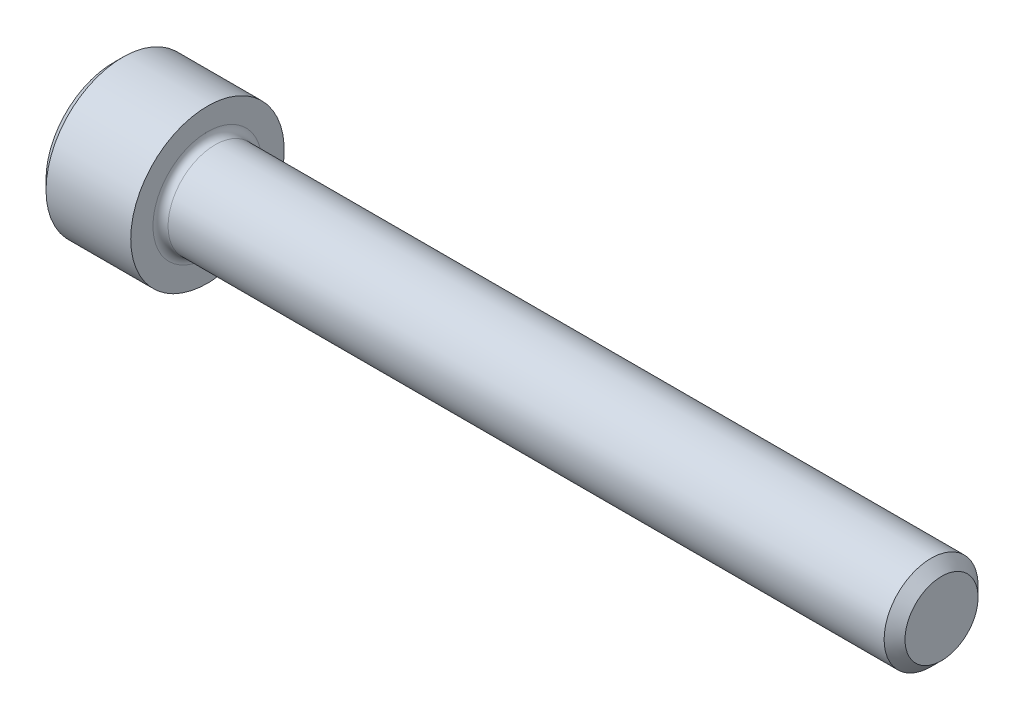
ISO-10303-21;
HEADER;
FILE_DESCRIPTION(('STEP AP214'),'2;1');
FILE_NAME('part.step','',(''),(''),'','','');
FILE_SCHEMA(('AUTOMOTIVE_DESIGN { 1 0 10303 214 1 1 1 1 }'));
ENDSEC;
DATA;
#1=APPLICATION_CONTEXT('core data for automotive mechanical design processes');
#2=APPLICATION_PROTOCOL_DEFINITION('international standard','automotive_design',2000,#1);
#3=PRODUCT_CONTEXT('',#1,'mechanical');
#4=PRODUCT('Part','Part','',(#3));
#5=PRODUCT_RELATED_PRODUCT_CATEGORY('part','',(#4));
#6=PRODUCT_DEFINITION_FORMATION('','',#4);
#7=PRODUCT_DEFINITION_CONTEXT('part definition',#1,'design');
#8=PRODUCT_DEFINITION('design','',#6,#7);
#9=PRODUCT_DEFINITION_SHAPE('','',#8);
#10=(LENGTH_UNIT() NAMED_UNIT(*) SI_UNIT(.MILLI.,.METRE.));
#11=(NAMED_UNIT(*) PLANE_ANGLE_UNIT() SI_UNIT($,.RADIAN.));
#12=(NAMED_UNIT(*) SI_UNIT($,.STERADIAN.) SOLID_ANGLE_UNIT());
#13=UNCERTAINTY_MEASURE_WITH_UNIT(LENGTH_MEASURE(1.E-05),#10,'distance_accuracy_value','');
#14=(GEOMETRIC_REPRESENTATION_CONTEXT(3) GLOBAL_UNCERTAINTY_ASSIGNED_CONTEXT((#13)) GLOBAL_UNIT_ASSIGNED_CONTEXT((#10,
#11,#12)) REPRESENTATION_CONTEXT('',''));
#15=CARTESIAN_POINT('',(0.,0.,0.));
#16=DIRECTION('',(0.,0.,1.));
#17=DIRECTION('',(1.,0.,0.));
#18=AXIS2_PLACEMENT_3D('',#15,#16,#17);
#19=CARTESIAN_POINT('',(0.,0.,0.));
#20=DIRECTION('',(-1.,0.,0.));
#21=DIRECTION('',(0.,0.,1.));
#22=AXIS2_PLACEMENT_3D('',#19,#20,#21);
#23=PLANE('',#22);
#24=DIRECTION('',(0.,-0.499999999999999,0.866025403784439));
#25=VECTOR('',#24,1.);
#26=CARTESIAN_POINT('',(0.,1.37848150271716,0.));
#27=LINE('',#26,#25);
#28=CARTESIAN_POINT('',(0.,1.37848150271716,0.));
#29=VERTEX_POINT('',#28);
#30=CARTESIAN_POINT('',(0.,0.689240751358581,1.1938));
#31=VERTEX_POINT('',#30);
#32=EDGE_CURVE('E259',#29,#31,#27,.T.);
#33=ORIENTED_EDGE('',*,*,#32,.T.);
#34=DIRECTION('',(0.,1.,0.));
#35=VECTOR('',#34,1.);
#36=CARTESIAN_POINT('',(0.,-0.689240751358569,1.1938));
#37=LINE('',#36,#35);
#38=CARTESIAN_POINT('',(0.,-0.689240751358569,1.1938));
#39=VERTEX_POINT('',#38);
#40=EDGE_CURVE('E130',#39,#31,#37,.T.);
#41=ORIENTED_EDGE('',*,*,#40,.F.);
#42=DIRECTION('',(0.,-0.500000000000001,-0.866025403784438));
#43=VECTOR('',#42,1.);
#44=CARTESIAN_POINT('',(0.,-0.689240751358569,1.1938));
#45=LINE('',#44,#43);
#46=CARTESIAN_POINT('',(0.,-1.37848150271715,0.));
#47=VERTEX_POINT('',#46);
#48=EDGE_CURVE('E262',#39,#47,#45,.T.);
#49=ORIENTED_EDGE('',*,*,#48,.T.);
#50=DIRECTION('',(0.,0.499999999999998,-0.86602540378444));
#51=VECTOR('',#50,1.);
#52=CARTESIAN_POINT('',(0.,-1.37848150271715,0.));
#53=LINE('',#52,#51);
#54=CARTESIAN_POINT('',(0.,-0.689240751358573,-1.1938));
#55=VERTEX_POINT('',#54);
#56=EDGE_CURVE('E265',#47,#55,#53,.T.);
#57=ORIENTED_EDGE('',*,*,#56,.T.);
#58=DIRECTION('',(0.,-1.,0.));
#59=VECTOR('',#58,1.);
#60=CARTESIAN_POINT('',(0.,0.689240751358577,-1.1938));
#61=LINE('',#60,#59);
#62=CARTESIAN_POINT('',(0.,0.689240751358577,-1.1938));
#63=VERTEX_POINT('',#62);
#64=EDGE_CURVE('E268',#63,#55,#61,.T.);
#65=ORIENTED_EDGE('',*,*,#64,.F.);
#66=DIRECTION('',(0.,-0.500000000000002,-0.866025403784437));
#67=VECTOR('',#66,1.);
#68=CARTESIAN_POINT('',(0.,1.37848150271716,0.));
#69=LINE('',#68,#67);
#70=EDGE_CURVE('E125',#29,#63,#69,.T.);
#71=ORIENTED_EDGE('',*,*,#70,.F.);
#72=EDGE_LOOP('',(#33,#41,#49,#57,#65,#71));
#73=FACE_BOUND('',#72,.T.);
#74=CARTESIAN_POINT('',(0.,0.,0.));
#75=DIRECTION('',(-1.,0.,0.));
#76=DIRECTION('',(0.,0.,1.));
#77=AXIS2_PLACEMENT_3D('',#74,#75,#76);
#78=CIRCLE('',#77,2.0447);
#79=CARTESIAN_POINT('',(0.,0.,2.0447));
#80=VERTEX_POINT('',#79);
#81=EDGE_CURVE('E154',#80,#80,#78,.T.);
#82=ORIENTED_EDGE('',*,*,#81,.T.);
#83=EDGE_LOOP('',(#82));
#84=FACE_BOUND('',#83,.T.);
#85=ADVANCED_FACE('F34',(#73,#84),#23,.T.);
#86=CARTESIAN_POINT('',(0.,0.,0.));
#87=DIRECTION('',(1.,0.,0.));
#88=DIRECTION('',(0.,0.,-1.));
#89=AXIS2_PLACEMENT_3D('',#86,#87,#88);
#90=CONICAL_SURFACE('',#89,2.0447,0.785398163397454);
#91=CARTESIAN_POINT('',(0.279399999999999,0.,0.));
#92=DIRECTION('',(-1.,0.,0.));
#93=DIRECTION('',(0.,0.,1.));
#94=AXIS2_PLACEMENT_3D('',#91,#92,#93);
#95=CIRCLE('',#94,2.3241);
#96=CARTESIAN_POINT('',(0.279399999999999,0.,2.3241));
#97=VERTEX_POINT('',#96);
#98=EDGE_CURVE('E151',#97,#97,#95,.T.);
#99=ORIENTED_EDGE('',*,*,#98,.T.);
#100=EDGE_LOOP('',(#99));
#101=FACE_BOUND('',#100,.T.);
#102=ORIENTED_EDGE('',*,*,#81,.F.);
#103=EDGE_LOOP('',(#102));
#104=FACE_BOUND('',#103,.T.);
#105=ADVANCED_FACE('F175',(#101,#104),#90,.T.);
#106=CARTESIAN_POINT('',(-31.75,0.,0.));
#107=DIRECTION('',(-1.,0.,0.));
#108=DIRECTION('',(0.,0.,1.));
#109=AXIS2_PLACEMENT_3D('',#106,#107,#108);
#110=CYLINDRICAL_SURFACE('',#109,2.3241);
#111=CARTESIAN_POINT('',(2.8448,0.,0.));
#112=DIRECTION('',(-1.,0.,0.));
#113=DIRECTION('',(0.,0.,1.));
#114=AXIS2_PLACEMENT_3D('',#111,#112,#113);
#115=CIRCLE('',#114,2.3241);
#116=CARTESIAN_POINT('',(2.8448,0.,2.3241));
#117=VERTEX_POINT('',#116);
#118=EDGE_CURVE('E148',#117,#117,#115,.T.);
#119=ORIENTED_EDGE('',*,*,#118,.T.);
#120=EDGE_LOOP('',(#119));
#121=FACE_BOUND('',#120,.T.);
#122=ORIENTED_EDGE('',*,*,#98,.F.);
#123=EDGE_LOOP('',(#122));
#124=FACE_BOUND('',#123,.T.);
#125=ADVANCED_FACE('F180',(#121,#124),#110,.T.);
#126=CARTESIAN_POINT('',(2.8448,2.3241,0.));
#127=DIRECTION('',(1.,0.,0.));
#128=DIRECTION('',(0.,0.,-1.));
#129=AXIS2_PLACEMENT_3D('',#126,#127,#128);
#130=PLANE('',#129);
#131=CARTESIAN_POINT('',(2.8448,0.,0.));
#132=DIRECTION('',(1.,0.,0.));
#133=DIRECTION('',(0.,0.,-1.));
#134=AXIS2_PLACEMENT_3D('',#131,#132,#133);
#135=CIRCLE('',#134,1.651);
#136=CARTESIAN_POINT('',(2.8448,0.,-1.651));
#137=VERTEX_POINT('',#136);
#138=EDGE_CURVE('E42',#137,#137,#135,.F.);
#139=ORIENTED_EDGE('',*,*,#138,.T.);
#140=EDGE_LOOP('',(#139));
#141=FACE_BOUND('',#140,.T.);
#142=ORIENTED_EDGE('',*,*,#118,.F.);
#143=EDGE_LOOP('',(#142));
#144=FACE_BOUND('',#143,.T.);
#145=ADVANCED_FACE('F159',(#141,#144),#130,.T.);
#146=CARTESIAN_POINT('',(-31.75,0.,0.));
#147=DIRECTION('',(-1.,0.,0.));
#148=DIRECTION('',(0.,0.,1.));
#149=AXIS2_PLACEMENT_3D('',#146,#147,#148);
#150=CYLINDRICAL_SURFACE('',#149,1.4224);
#151=CARTESIAN_POINT('',(3.0734,0.,0.));
#152=DIRECTION('',(1.,0.,0.));
#153=DIRECTION('',(0.,0.,-1.));
#154=AXIS2_PLACEMENT_3D('',#151,#152,#153);
#155=CIRCLE('',#154,1.4224);
#156=CARTESIAN_POINT('',(3.0734,0.,-1.4224));
#157=VERTEX_POINT('',#156);
#158=EDGE_CURVE('E11',#157,#157,#155,.T.);
#159=ORIENTED_EDGE('',*,*,#158,.T.);
#160=EDGE_LOOP('',(#159));
#161=FACE_BOUND('',#160,.T.);
#162=CARTESIAN_POINT('',(24.75357,0.,0.));
#163=DIRECTION('',(-1.,0.,0.));
#164=DIRECTION('',(0.,0.,1.));
#165=AXIS2_PLACEMENT_3D('',#162,#163,#164);
#166=CIRCLE('',#165,1.4224);
#167=CARTESIAN_POINT('',(24.75357,0.,1.4224));
#168=VERTEX_POINT('',#167);
#169=EDGE_CURVE('E145',#168,#168,#166,.T.);
#170=ORIENTED_EDGE('',*,*,#169,.T.);
#171=EDGE_LOOP('',(#170));
#172=FACE_BOUND('',#171,.T.);
#173=ADVANCED_FACE('F190',(#161,#172),#150,.T.);
#174=CARTESIAN_POINT('',(25.0698,0.,0.));
#175=DIRECTION('',(-1.,0.,0.));
#176=DIRECTION('',(0.,0.,1.));
#177=AXIS2_PLACEMENT_3D('',#174,#175,#176);
#178=CONICAL_SURFACE('',#177,1.10617,0.785398163397459);
#179=ORIENTED_EDGE('',*,*,#169,.F.);
#180=EDGE_LOOP('',(#179));
#181=FACE_BOUND('',#180,.T.);
#182=CARTESIAN_POINT('',(25.0698,0.,0.));
#183=DIRECTION('',(-1.,0.,0.));
#184=DIRECTION('',(0.,0.,1.));
#185=AXIS2_PLACEMENT_3D('',#182,#183,#184);
#186=CIRCLE('',#185,1.10617);
#187=CARTESIAN_POINT('',(25.0698,0.,1.10617));
#188=VERTEX_POINT('',#187);
#189=EDGE_CURVE('E141',#188,#188,#186,.T.);
#190=ORIENTED_EDGE('',*,*,#189,.T.);
#191=EDGE_LOOP('',(#190));
#192=FACE_BOUND('',#191,.T.);
#193=ADVANCED_FACE('F170',(#181,#192),#178,.T.);
#194=CARTESIAN_POINT('',(25.0698,1.10617,0.));
#195=DIRECTION('',(1.,0.,0.));
#196=DIRECTION('',(0.,0.,-1.));
#197=AXIS2_PLACEMENT_3D('',#194,#195,#196);
#198=PLANE('',#197);
#199=ORIENTED_EDGE('',*,*,#189,.F.);
#200=EDGE_LOOP('',(#199));
#201=FACE_BOUND('',#200,.T.);
#202=ADVANCED_FACE('F163',(#201),#198,.T.);
#203=CARTESIAN_POINT('',(3.0734,0.,0.));
#204=DIRECTION('',(1.,0.,0.));
#205=DIRECTION('',(0.,0.,-1.));
#206=AXIS2_PLACEMENT_3D('',#203,#204,#205);
#207=TOROIDAL_SURFACE('',#206,1.651,0.2286);
#208=ORIENTED_EDGE('',*,*,#158,.F.);
#209=EDGE_LOOP('',(#208));
#210=FACE_BOUND('',#209,.T.);
#211=ORIENTED_EDGE('',*,*,#138,.F.);
#212=EDGE_LOOP('',(#211));
#213=FACE_BOUND('',#212,.T.);
#214=ADVANCED_FACE('F36',(#210,#213),#207,.F.);
#215=CARTESIAN_POINT('',(1.2954,1.37848150271716,0.));
#216=DIRECTION('',(0.,-0.866025403784439,-0.499999999999999));
#217=DIRECTION('',(0.,0.499999999999999,-0.866025403784439));
#218=AXIS2_PLACEMENT_3D('',#215,#216,#217);
#219=PLANE('',#218);
#220=ORIENTED_EDGE('',*,*,#32,.F.);
#221=DIRECTION('',(-1.,0.,0.));
#222=VECTOR('',#221,1.);
#223=CARTESIAN_POINT('',(1.2954,1.37848150271716,0.));
#224=LINE('',#223,#222);
#225=CARTESIAN_POINT('',(1.2954,1.37848150271716,0.));
#226=VERTEX_POINT('',#225);
#227=EDGE_CURVE('E249',#226,#29,#224,.T.);
#228=ORIENTED_EDGE('',*,*,#227,.F.);
#229=DIRECTION('',(0.,-0.499999999999999,0.866025403784439));
#230=VECTOR('',#229,1.);
#231=CARTESIAN_POINT('',(1.2954,1.37848150271716,0.));
#232=LINE('',#231,#230);
#233=CARTESIAN_POINT('',(1.2954,1.03386112703787,0.5969));
#234=VERTEX_POINT('',#233);
#235=EDGE_CURVE('E117',#226,#234,#232,.T.);
#236=ORIENTED_EDGE('',*,*,#235,.T.);
#237=CARTESIAN_POINT('',(1.2954,0.689240751358581,1.1938));
#238=VERTEX_POINT('',#237);
#239=EDGE_CURVE('E108',#234,#238,#232,.T.);
#240=ORIENTED_EDGE('',*,*,#239,.T.);
#241=DIRECTION('',(-1.,0.,0.));
#242=VECTOR('',#241,1.);
#243=CARTESIAN_POINT('',(1.2954,0.689240751358581,1.1938));
#244=LINE('',#243,#242);
#245=EDGE_CURVE('E122',#238,#31,#244,.T.);
#246=ORIENTED_EDGE('',*,*,#245,.T.);
#247=EDGE_LOOP('',(#220,#228,#236,#240,#246));
#248=FACE_BOUND('',#247,.T.);
#249=ADVANCED_FACE('F121',(#248),#219,.T.);
#250=CARTESIAN_POINT('',(1.2954,-0.689240751358569,1.1938));
#251=DIRECTION('',(0.,0.,1.));
#252=DIRECTION('',(0.,-1.,0.));
#253=AXIS2_PLACEMENT_3D('',#250,#251,#252);
#254=PLANE('',#253);
#255=ORIENTED_EDGE('',*,*,#40,.T.);
#256=ORIENTED_EDGE('',*,*,#245,.F.);
#257=DIRECTION('',(0.,1.,0.));
#258=VECTOR('',#257,1.);
#259=CARTESIAN_POINT('',(1.2954,-0.689240751358569,1.1938));
#260=LINE('',#259,#258);
#261=CARTESIAN_POINT('',(1.2954,0.,1.1938));
#262=VERTEX_POINT('',#261);
#263=EDGE_CURVE('E105',#262,#238,#260,.T.);
#264=ORIENTED_EDGE('',*,*,#263,.F.);
#265=CARTESIAN_POINT('',(1.2954,-0.689240751358569,1.1938));
#266=VERTEX_POINT('',#265);
#267=EDGE_CURVE('E116',#266,#262,#260,.T.);
#268=ORIENTED_EDGE('',*,*,#267,.F.);
#269=DIRECTION('',(-1.,0.,0.));
#270=VECTOR('',#269,1.);
#271=CARTESIAN_POINT('',(1.2954,-0.689240751358569,1.1938));
#272=LINE('',#271,#270);
#273=EDGE_CURVE('E132',#266,#39,#272,.T.);
#274=ORIENTED_EDGE('',*,*,#273,.T.);
#275=EDGE_LOOP('',(#255,#256,#264,#268,#274));
#276=FACE_BOUND('',#275,.T.);
#277=ADVANCED_FACE('F127',(#276),#254,.F.);
#278=CARTESIAN_POINT('',(1.2954,-0.689240751358569,1.1938));
#279=DIRECTION('',(0.,0.866025403784438,-0.500000000000001));
#280=DIRECTION('',(0.,0.500000000000001,0.866025403784438));
#281=AXIS2_PLACEMENT_3D('',#278,#279,#280);
#282=PLANE('',#281);
#283=ORIENTED_EDGE('',*,*,#48,.F.);
#284=ORIENTED_EDGE('',*,*,#273,.F.);
#285=DIRECTION('',(0.,-0.500000000000001,-0.866025403784438));
#286=VECTOR('',#285,1.);
#287=CARTESIAN_POINT('',(1.2954,-0.689240751358569,1.1938));
#288=LINE('',#287,#286);
#289=CARTESIAN_POINT('',(1.2954,-1.03386112703786,0.596899999999999));
#290=VERTEX_POINT('',#289);
#291=EDGE_CURVE('E288',#266,#290,#288,.T.);
#292=ORIENTED_EDGE('',*,*,#291,.T.);
#293=CARTESIAN_POINT('',(1.2954,-1.37848150271715,0.));
#294=VERTEX_POINT('',#293);
#295=EDGE_CURVE('E277',#290,#294,#288,.T.);
#296=ORIENTED_EDGE('',*,*,#295,.T.);
#297=DIRECTION('',(-1.,0.,0.));
#298=VECTOR('',#297,1.);
#299=CARTESIAN_POINT('',(1.2954,-1.37848150271715,0.));
#300=LINE('',#299,#298);
#301=EDGE_CURVE('E137',#294,#47,#300,.T.);
#302=ORIENTED_EDGE('',*,*,#301,.T.);
#303=EDGE_LOOP('',(#283,#284,#292,#296,#302));
#304=FACE_BOUND('',#303,.T.);
#305=ADVANCED_FACE('F203',(#304),#282,.T.);
#306=CARTESIAN_POINT('',(1.2954,-1.37848150271715,0.));
#307=DIRECTION('',(0.,0.86602540378444,0.499999999999998));
#308=DIRECTION('',(0.,-0.499999999999998,0.86602540378444));
#309=AXIS2_PLACEMENT_3D('',#306,#307,#308);
#310=PLANE('',#309);
#311=ORIENTED_EDGE('',*,*,#56,.F.);
#312=ORIENTED_EDGE('',*,*,#301,.F.);
#313=DIRECTION('',(0.,0.499999999999998,-0.86602540378444));
#314=VECTOR('',#313,1.);
#315=CARTESIAN_POINT('',(1.2954,-1.37848150271715,0.));
#316=LINE('',#315,#314);
#317=CARTESIAN_POINT('',(1.2954,-1.03386112703786,-0.596899999999997));
#318=VERTEX_POINT('',#317);
#319=EDGE_CURVE('E255',#294,#318,#316,.T.);
#320=ORIENTED_EDGE('',*,*,#319,.T.);
#321=CARTESIAN_POINT('',(1.2954,-0.689240751358573,-1.1938));
#322=VERTEX_POINT('',#321);
#323=EDGE_CURVE('E287',#318,#322,#316,.T.);
#324=ORIENTED_EDGE('',*,*,#323,.T.);
#325=DIRECTION('',(-1.,0.,0.));
#326=VECTOR('',#325,1.);
#327=CARTESIAN_POINT('',(1.2954,-0.689240751358573,-1.1938));
#328=LINE('',#327,#326);
#329=EDGE_CURVE('E248',#322,#55,#328,.T.);
#330=ORIENTED_EDGE('',*,*,#329,.T.);
#331=EDGE_LOOP('',(#311,#312,#320,#324,#330));
#332=FACE_BOUND('',#331,.T.);
#333=ADVANCED_FACE('F206',(#332),#310,.T.);
#334=CARTESIAN_POINT('',(1.2954,0.689240751358577,-1.1938));
#335=DIRECTION('',(0.,0.,-1.));
#336=DIRECTION('',(0.,1.,0.));
#337=AXIS2_PLACEMENT_3D('',#334,#335,#336);
#338=PLANE('',#337);
#339=ORIENTED_EDGE('',*,*,#64,.T.);
#340=ORIENTED_EDGE('',*,*,#329,.F.);
#341=DIRECTION('',(0.,-1.,0.));
#342=VECTOR('',#341,1.);
#343=CARTESIAN_POINT('',(1.2954,0.689240751358577,-1.1938));
#344=LINE('',#343,#342);
#345=CARTESIAN_POINT('',(1.2954,0.,-1.1938));
#346=VERTEX_POINT('',#345);
#347=EDGE_CURVE('E252',#346,#322,#344,.T.);
#348=ORIENTED_EDGE('',*,*,#347,.F.);
#349=CARTESIAN_POINT('',(1.2954,0.689240751358577,-1.1938));
#350=VERTEX_POINT('',#349);
#351=EDGE_CURVE('E49',#350,#346,#344,.T.);
#352=ORIENTED_EDGE('',*,*,#351,.F.);
#353=DIRECTION('',(-1.,0.,0.));
#354=VECTOR('',#353,1.);
#355=CARTESIAN_POINT('',(1.2954,0.689240751358577,-1.1938));
#356=LINE('',#355,#354);
#357=EDGE_CURVE('E245',#350,#63,#356,.T.);
#358=ORIENTED_EDGE('',*,*,#357,.T.);
#359=EDGE_LOOP('',(#339,#340,#348,#352,#358));
#360=FACE_BOUND('',#359,.T.);
#361=ADVANCED_FACE('F210',(#360),#338,.F.);
#362=CARTESIAN_POINT('',(1.2954,1.37848150271716,0.));
#363=DIRECTION('',(0.,0.866025403784437,-0.500000000000002));
#364=DIRECTION('',(0.,0.500000000000002,0.866025403784437));
#365=AXIS2_PLACEMENT_3D('',#362,#363,#364);
#366=PLANE('',#365);
#367=ORIENTED_EDGE('',*,*,#70,.T.);
#368=ORIENTED_EDGE('',*,*,#357,.F.);
#369=DIRECTION('',(0.,-0.500000000000002,-0.866025403784437));
#370=VECTOR('',#369,1.);
#371=CARTESIAN_POINT('',(1.2954,1.37848150271716,0.));
#372=LINE('',#371,#370);
#373=CARTESIAN_POINT('',(1.2954,1.03386112703787,-0.596900000000005));
#374=VERTEX_POINT('',#373);
#375=EDGE_CURVE('E235',#374,#350,#372,.T.);
#376=ORIENTED_EDGE('',*,*,#375,.F.);
#377=EDGE_CURVE('E241',#226,#374,#372,.T.);
#378=ORIENTED_EDGE('',*,*,#377,.F.);
#379=ORIENTED_EDGE('',*,*,#227,.T.);
#380=EDGE_LOOP('',(#367,#368,#376,#378,#379));
#381=FACE_BOUND('',#380,.T.);
#382=ADVANCED_FACE('F214',(#381),#366,.F.);
#383=CARTESIAN_POINT('',(1.2954,1.37848150271716,0.));
#384=DIRECTION('',(1.,0.,0.));
#385=DIRECTION('',(0.,0.,-1.));
#386=AXIS2_PLACEMENT_3D('',#383,#384,#385);
#387=PLANE('',#386);
#388=ORIENTED_EDGE('',*,*,#347,.T.);
#389=ORIENTED_EDGE('',*,*,#323,.F.);
#390=CARTESIAN_POINT('',(1.2954,0.,0.));
#391=DIRECTION('',(-1.,0.,0.));
#392=DIRECTION('',(0.,0.,1.));
#393=AXIS2_PLACEMENT_3D('',#390,#391,#392);
#394=CIRCLE('',#393,1.1938);
#395=EDGE_CURVE('E283',#346,#318,#394,.T.);
#396=ORIENTED_EDGE('',*,*,#395,.F.);
#397=EDGE_LOOP('',(#388,#389,#396));
#398=FACE_BOUND('',#397,.T.);
#399=ADVANCED_FACE('F218',(#398),#387,.F.);
#400=ORIENTED_EDGE('',*,*,#319,.F.);
#401=ORIENTED_EDGE('',*,*,#295,.F.);
#402=EDGE_CURVE('E135',#318,#290,#394,.T.);
#403=ORIENTED_EDGE('',*,*,#402,.F.);
#404=EDGE_LOOP('',(#400,#401,#403));
#405=FACE_BOUND('',#404,.T.);
#406=ADVANCED_FACE('F221',(#405),#387,.F.);
#407=ORIENTED_EDGE('',*,*,#291,.F.);
#408=ORIENTED_EDGE('',*,*,#267,.T.);
#409=EDGE_CURVE('E131',#290,#262,#394,.T.);
#410=ORIENTED_EDGE('',*,*,#409,.F.);
#411=EDGE_LOOP('',(#407,#408,#410));
#412=FACE_BOUND('',#411,.T.);
#413=ADVANCED_FACE('F226',(#412),#387,.F.);
#414=ORIENTED_EDGE('',*,*,#263,.T.);
#415=ORIENTED_EDGE('',*,*,#239,.F.);
#416=EDGE_CURVE('E111',#262,#234,#394,.T.);
#417=ORIENTED_EDGE('',*,*,#416,.F.);
#418=EDGE_LOOP('',(#414,#415,#417));
#419=FACE_BOUND('',#418,.T.);
#420=ADVANCED_FACE('F107',(#419),#387,.F.);
#421=ORIENTED_EDGE('',*,*,#235,.F.);
#422=ORIENTED_EDGE('',*,*,#377,.T.);
#423=EDGE_CURVE('E142',#234,#374,#394,.T.);
#424=ORIENTED_EDGE('',*,*,#423,.F.);
#425=EDGE_LOOP('',(#421,#422,#424));
#426=FACE_BOUND('',#425,.T.);
#427=ADVANCED_FACE('F229',(#426),#387,.F.);
#428=ORIENTED_EDGE('',*,*,#375,.T.);
#429=ORIENTED_EDGE('',*,*,#351,.T.);
#430=EDGE_CURVE('E238',#374,#346,#394,.T.);
#431=ORIENTED_EDGE('',*,*,#430,.F.);
#432=EDGE_LOOP('',(#428,#429,#431));
#433=FACE_BOUND('',#432,.T.);
#434=ADVANCED_FACE('F199',(#433),#387,.F.);
#435=CARTESIAN_POINT('',(1.2954,0.,0.));
#436=DIRECTION('',(-1.,0.,0.));
#437=DIRECTION('',(0.,0.,1.));
#438=AXIS2_PLACEMENT_3D('',#435,#436,#437);
#439=CONICAL_SURFACE('',#438,1.1938,1.04719755119659);
#440=CARTESIAN_POINT('',(1.98464075135858,0.,0.));
#441=VERTEX_POINT('',#440);
#442=VERTEX_LOOP('',#441);
#443=FACE_BOUND('',#442,.T.);
#444=ORIENTED_EDGE('',*,*,#416,.T.);
#445=ORIENTED_EDGE('',*,*,#423,.T.);
#446=ORIENTED_EDGE('',*,*,#430,.T.);
#447=ORIENTED_EDGE('',*,*,#395,.T.);
#448=ORIENTED_EDGE('',*,*,#402,.T.);
#449=ORIENTED_EDGE('',*,*,#409,.T.);
#450=EDGE_LOOP('',(#444,#445,#446,#447,#448,#449));
#451=FACE_BOUND('',#450,.T.);
#452=ADVANCED_FACE('F197',(#443,#451),#439,.F.);
#453=CLOSED_SHELL('',(#85,#105,#125,#145,#173,#193,#202,#214,#249,#277,#305,#333,#361,#382,#399,
#406,#413,#420,#427,#434,#452));
#454=MANIFOLD_SOLID_BREP('B2',#453);
#455=ADVANCED_BREP_SHAPE_REPRESENTATION('',(#18,#454),#14);
#456=SHAPE_DEFINITION_REPRESENTATION(#9,#455);
ENDSEC;
END-ISO-10303-21;
